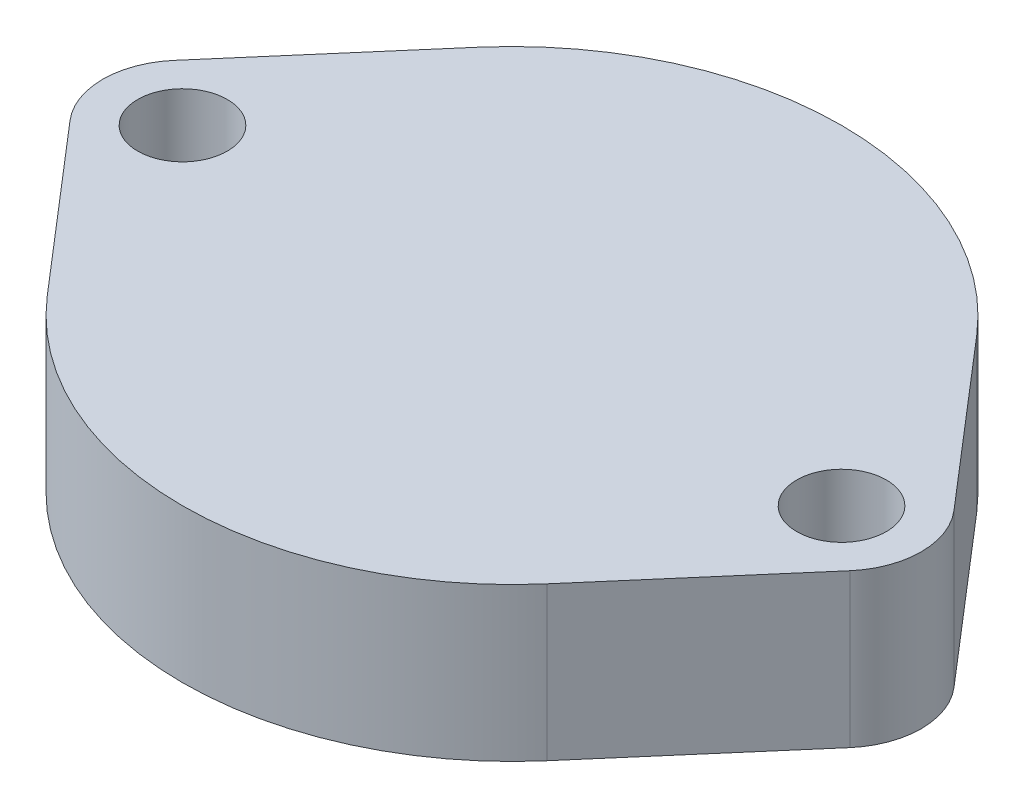
ISO-10303-21;
HEADER;
FILE_DESCRIPTION(('STEP AP214'),'2;1');
FILE_NAME('part.step','',(''),(''),'','','');
FILE_SCHEMA(('AUTOMOTIVE_DESIGN { 1 0 10303 214 1 1 1 1 }'));
ENDSEC;
DATA;
#1=APPLICATION_CONTEXT('core data for automotive mechanical design processes');
#2=APPLICATION_PROTOCOL_DEFINITION('international standard','automotive_design',2000,#1);
#3=PRODUCT_CONTEXT('',#1,'mechanical');
#4=PRODUCT('Part','Part','',(#3));
#5=PRODUCT_RELATED_PRODUCT_CATEGORY('part','',(#4));
#6=PRODUCT_DEFINITION_FORMATION('','',#4);
#7=PRODUCT_DEFINITION_CONTEXT('part definition',#1,'design');
#8=PRODUCT_DEFINITION('design','',#6,#7);
#9=PRODUCT_DEFINITION_SHAPE('','',#8);
#10=(LENGTH_UNIT() NAMED_UNIT(*) SI_UNIT(.MILLI.,.METRE.));
#11=(NAMED_UNIT(*) PLANE_ANGLE_UNIT() SI_UNIT($,.RADIAN.));
#12=(NAMED_UNIT(*) SI_UNIT($,.STERADIAN.) SOLID_ANGLE_UNIT());
#13=UNCERTAINTY_MEASURE_WITH_UNIT(LENGTH_MEASURE(1.E-05),#10,'distance_accuracy_value','');
#14=(GEOMETRIC_REPRESENTATION_CONTEXT(3) GLOBAL_UNCERTAINTY_ASSIGNED_CONTEXT((#13)) GLOBAL_UNIT_ASSIGNED_CONTEXT((#10,
#11,#12)) REPRESENTATION_CONTEXT('',''));
#15=CARTESIAN_POINT('',(0.,0.,0.));
#16=DIRECTION('',(0.,0.,1.));
#17=DIRECTION('',(1.,0.,0.));
#18=AXIS2_PLACEMENT_3D('',#15,#16,#17);
#19=CARTESIAN_POINT('',(-12.7,5.9055,0.));
#20=DIRECTION('',(0.,1.,0.));
#21=DIRECTION('',(0.,0.,1.));
#22=AXIS2_PLACEMENT_3D('',#19,#20,#21);
#23=PLANE('',#22);
#24=CARTESIAN_POINT('',(-12.7,5.9055,0.));
#25=DIRECTION('',(0.,1.,0.));
#26=DIRECTION('',(0.,0.,1.));
#27=AXIS2_PLACEMENT_3D('',#24,#25,#26);
#28=CIRCLE('',#27,1.7272);
#29=CARTESIAN_POINT('',(-12.7,5.9055,1.7272));
#30=VERTEX_POINT('',#29);
#31=EDGE_CURVE('E146',#30,#30,#28,.T.);
#32=ORIENTED_EDGE('',*,*,#31,.F.);
#33=EDGE_LOOP('',(#32));
#34=FACE_BOUND('',#33,.T.);
#35=CARTESIAN_POINT('',(-12.7,5.9055,0.));
#36=DIRECTION('',(0.,1.,0.));
#37=DIRECTION('',(0.,0.,1.));
#38=AXIS2_PLACEMENT_3D('',#35,#36,#37);
#39=CIRCLE('',#38,3.0734);
#40=CARTESIAN_POINT('',(-15.0296372,5.9055,-2.00463913869209));
#41=VERTEX_POINT('',#40);
#42=CARTESIAN_POINT('',(-15.0296372,5.9055,2.00463913869209));
#43=VERTEX_POINT('',#42);
#44=EDGE_CURVE('E164',#41,#43,#39,.T.);
#45=ORIENTED_EDGE('',*,*,#44,.T.);
#46=DIRECTION('',(0.652254551536438,0.,0.758));
#47=VECTOR('',#46,1.);
#48=CARTESIAN_POINT('',(-15.0296372,5.9055,2.00463913869209));
#49=LINE('',#48,#47);
#50=CARTESIAN_POINT('',(-9.62660000000001,5.9055,8.28363280451276));
#51=VERTEX_POINT('',#50);
#52=EDGE_CURVE('E100',#43,#51,#49,.T.);
#53=ORIENTED_EDGE('',*,*,#52,.T.);
#54=CARTESIAN_POINT('',(0.,5.9055,0.));
#55=DIRECTION('',(0.,1.,0.));
#56=DIRECTION('',(0.,0.,1.));
#57=AXIS2_PLACEMENT_3D('',#54,#55,#56);
#58=CIRCLE('',#57,12.7);
#59=CARTESIAN_POINT('',(9.6266,5.9055,8.28363280451276));
#60=VERTEX_POINT('',#59);
#61=EDGE_CURVE('E185',#51,#60,#58,.T.);
#62=ORIENTED_EDGE('',*,*,#61,.T.);
#63=DIRECTION('',(0.652254551536438,0.,-0.758));
#64=VECTOR('',#63,1.);
#65=CARTESIAN_POINT('',(15.0296372,5.9055,2.00463913869209));
#66=LINE('',#65,#64);
#67=CARTESIAN_POINT('',(15.0296372,5.9055,2.00463913869209));
#68=VERTEX_POINT('',#67);
#69=EDGE_CURVE('E199',#60,#68,#66,.T.);
#70=ORIENTED_EDGE('',*,*,#69,.T.);
#71=CARTESIAN_POINT('',(12.7,5.9055,0.));
#72=DIRECTION('',(0.,1.,0.));
#73=DIRECTION('',(0.,0.,1.));
#74=AXIS2_PLACEMENT_3D('',#71,#72,#73);
#75=CIRCLE('',#74,3.0734);
#76=CARTESIAN_POINT('',(15.0296372,5.9055,-2.00463913869209));
#77=VERTEX_POINT('',#76);
#78=EDGE_CURVE('E119',#68,#77,#75,.T.);
#79=ORIENTED_EDGE('',*,*,#78,.T.);
#80=DIRECTION('',(-0.652254551536438,0.,-0.758));
#81=VECTOR('',#80,1.);
#82=CARTESIAN_POINT('',(9.6266,5.9055,-8.28363280451276));
#83=LINE('',#82,#81);
#84=CARTESIAN_POINT('',(9.6266,5.9055,-8.28363280451276));
#85=VERTEX_POINT('',#84);
#86=EDGE_CURVE('E113',#77,#85,#83,.T.);
#87=ORIENTED_EDGE('',*,*,#86,.T.);
#88=CARTESIAN_POINT('',(0.,5.9055,0.));
#89=DIRECTION('',(0.,1.,0.));
#90=DIRECTION('',(0.,0.,1.));
#91=AXIS2_PLACEMENT_3D('',#88,#89,#90);
#92=CIRCLE('',#91,12.7);
#93=CARTESIAN_POINT('',(-9.6266,5.9055,-8.28363280451276));
#94=VERTEX_POINT('',#93);
#95=EDGE_CURVE('E117',#85,#94,#92,.T.);
#96=ORIENTED_EDGE('',*,*,#95,.T.);
#97=DIRECTION('',(-0.652254551536438,0.,0.758));
#98=VECTOR('',#97,1.);
#99=CARTESIAN_POINT('',(-15.0296372,5.9055,-2.00463913869209));
#100=LINE('',#99,#98);
#101=EDGE_CURVE('E57',#94,#41,#100,.T.);
#102=ORIENTED_EDGE('',*,*,#101,.T.);
#103=EDGE_LOOP('',(#45,#53,#62,#70,#79,#87,#96,#102));
#104=FACE_BOUND('',#103,.T.);
#105=CARTESIAN_POINT('',(12.7,5.9055,0.));
#106=DIRECTION('',(0.,1.,0.));
#107=DIRECTION('',(0.,0.,1.));
#108=AXIS2_PLACEMENT_3D('',#105,#106,#107);
#109=CIRCLE('',#108,1.7272);
#110=CARTESIAN_POINT('',(12.7,5.9055,1.7272));
#111=VERTEX_POINT('',#110);
#112=EDGE_CURVE('E213',#111,#111,#109,.T.);
#113=ORIENTED_EDGE('',*,*,#112,.F.);
#114=EDGE_LOOP('',(#113));
#115=FACE_BOUND('',#114,.T.);
#116=ADVANCED_FACE('F39',(#34,#104,#115),#23,.T.);
#117=CARTESIAN_POINT('',(-12.7,0.,0.));
#118=DIRECTION('',(0.,1.,0.));
#119=DIRECTION('',(0.,0.,1.));
#120=AXIS2_PLACEMENT_3D('',#117,#118,#119);
#121=PLANE('',#120);
#122=CARTESIAN_POINT('',(-12.7,0.,0.));
#123=DIRECTION('',(0.,1.,0.));
#124=DIRECTION('',(0.,0.,1.));
#125=AXIS2_PLACEMENT_3D('',#122,#123,#124);
#126=CIRCLE('',#125,3.0734);
#127=CARTESIAN_POINT('',(-15.0296372,0.,-2.00463913869209));
#128=VERTEX_POINT('',#127);
#129=CARTESIAN_POINT('',(-15.0296372,0.,2.00463913869209));
#130=VERTEX_POINT('',#129);
#131=EDGE_CURVE('E141',#128,#130,#126,.T.);
#132=ORIENTED_EDGE('',*,*,#131,.F.);
#133=DIRECTION('',(-0.652254551536438,0.,0.758));
#134=VECTOR('',#133,1.);
#135=CARTESIAN_POINT('',(-15.0296372,0.,-2.00463913869209));
#136=LINE('',#135,#134);
#137=CARTESIAN_POINT('',(-9.6266,0.,-8.28363280451276));
#138=VERTEX_POINT('',#137);
#139=EDGE_CURVE('E92',#138,#128,#136,.T.);
#140=ORIENTED_EDGE('',*,*,#139,.F.);
#141=CARTESIAN_POINT('',(0.,0.,0.));
#142=DIRECTION('',(0.,1.,0.));
#143=DIRECTION('',(0.,0.,1.));
#144=AXIS2_PLACEMENT_3D('',#141,#142,#143);
#145=CIRCLE('',#144,12.7);
#146=CARTESIAN_POINT('',(9.6266,0.,-8.28363280451276));
#147=VERTEX_POINT('',#146);
#148=EDGE_CURVE('E86',#147,#138,#145,.T.);
#149=ORIENTED_EDGE('',*,*,#148,.F.);
#150=DIRECTION('',(-0.652254551536438,0.,-0.758));
#151=VECTOR('',#150,1.);
#152=CARTESIAN_POINT('',(9.6266,0.,-8.28363280451276));
#153=LINE('',#152,#151);
#154=CARTESIAN_POINT('',(15.0296372,0.,-2.00463913869209));
#155=VERTEX_POINT('',#154);
#156=EDGE_CURVE('E128',#155,#147,#153,.T.);
#157=ORIENTED_EDGE('',*,*,#156,.F.);
#158=CARTESIAN_POINT('',(12.7,0.,0.));
#159=DIRECTION('',(0.,1.,0.));
#160=DIRECTION('',(0.,0.,1.));
#161=AXIS2_PLACEMENT_3D('',#158,#159,#160);
#162=CIRCLE('',#161,3.0734);
#163=CARTESIAN_POINT('',(15.0296372,0.,2.00463913869209));
#164=VERTEX_POINT('',#163);
#165=EDGE_CURVE('E155',#164,#155,#162,.T.);
#166=ORIENTED_EDGE('',*,*,#165,.F.);
#167=DIRECTION('',(0.652254551536438,0.,-0.758));
#168=VECTOR('',#167,1.);
#169=CARTESIAN_POINT('',(15.0296372,0.,2.00463913869209));
#170=LINE('',#169,#168);
#171=CARTESIAN_POINT('',(9.6266,0.,8.28363280451276));
#172=VERTEX_POINT('',#171);
#173=EDGE_CURVE('E152',#172,#164,#170,.T.);
#174=ORIENTED_EDGE('',*,*,#173,.F.);
#175=CARTESIAN_POINT('',(0.,0.,0.));
#176=DIRECTION('',(0.,1.,0.));
#177=DIRECTION('',(0.,0.,1.));
#178=AXIS2_PLACEMENT_3D('',#175,#176,#177);
#179=CIRCLE('',#178,12.7);
#180=CARTESIAN_POINT('',(-9.62660000000001,0.,8.28363280451276));
#181=VERTEX_POINT('',#180);
#182=EDGE_CURVE('E149',#181,#172,#179,.T.);
#183=ORIENTED_EDGE('',*,*,#182,.F.);
#184=DIRECTION('',(0.652254551536438,0.,0.758));
#185=VECTOR('',#184,1.);
#186=CARTESIAN_POINT('',(-15.0296372,0.,2.00463913869209));
#187=LINE('',#186,#185);
#188=EDGE_CURVE('E145',#130,#181,#187,.T.);
#189=ORIENTED_EDGE('',*,*,#188,.F.);
#190=EDGE_LOOP('',(#132,#140,#149,#157,#166,#174,#183,#189));
#191=FACE_BOUND('',#190,.T.);
#192=CARTESIAN_POINT('',(-12.7,0.,0.));
#193=DIRECTION('',(0.,1.,0.));
#194=DIRECTION('',(0.,0.,1.));
#195=AXIS2_PLACEMENT_3D('',#192,#193,#194);
#196=CIRCLE('',#195,1.7272);
#197=CARTESIAN_POINT('',(-12.7,0.,1.7272));
#198=VERTEX_POINT('',#197);
#199=EDGE_CURVE('E209',#198,#198,#196,.T.);
#200=ORIENTED_EDGE('',*,*,#199,.T.);
#201=EDGE_LOOP('',(#200));
#202=FACE_BOUND('',#201,.T.);
#203=CARTESIAN_POINT('',(12.7,0.,0.));
#204=DIRECTION('',(0.,1.,0.));
#205=DIRECTION('',(0.,0.,1.));
#206=AXIS2_PLACEMENT_3D('',#203,#204,#205);
#207=CIRCLE('',#206,1.7272);
#208=CARTESIAN_POINT('',(12.7,0.,1.7272));
#209=VERTEX_POINT('',#208);
#210=EDGE_CURVE('E217',#209,#209,#207,.T.);
#211=ORIENTED_EDGE('',*,*,#210,.T.);
#212=EDGE_LOOP('',(#211));
#213=FACE_BOUND('',#212,.T.);
#214=ADVANCED_FACE('F189',(#191,#202,#213),#121,.F.);
#215=CARTESIAN_POINT('',(-12.7,5.9055,0.));
#216=DIRECTION('',(0.,-1.,0.));
#217=DIRECTION('',(0.,0.,-1.));
#218=AXIS2_PLACEMENT_3D('',#215,#216,#217);
#219=CYLINDRICAL_SURFACE('',#218,3.0734);
#220=ORIENTED_EDGE('',*,*,#131,.T.);
#221=DIRECTION('',(0.,-1.,0.));
#222=VECTOR('',#221,1.);
#223=CARTESIAN_POINT('',(-15.0296372,5.9055,2.00463913869209));
#224=LINE('',#223,#222);
#225=EDGE_CURVE('E11',#43,#130,#224,.T.);
#226=ORIENTED_EDGE('',*,*,#225,.F.);
#227=ORIENTED_EDGE('',*,*,#44,.F.);
#228=DIRECTION('',(0.,-1.,0.));
#229=VECTOR('',#228,1.);
#230=CARTESIAN_POINT('',(-15.0296372,5.9055,-2.00463913869209));
#231=LINE('',#230,#229);
#232=EDGE_CURVE('E137',#41,#128,#231,.T.);
#233=ORIENTED_EDGE('',*,*,#232,.T.);
#234=EDGE_LOOP('',(#220,#226,#227,#233));
#235=FACE_BOUND('',#234,.T.);
#236=ADVANCED_FACE('F41',(#235),#219,.T.);
#237=CARTESIAN_POINT('',(-15.0296372,5.9055,2.00463913869209));
#238=DIRECTION('',(0.758,0.,-0.652254551536438));
#239=DIRECTION('',(-0.652254551536438,0.,-0.758));
#240=AXIS2_PLACEMENT_3D('',#237,#238,#239);
#241=PLANE('',#240);
#242=ORIENTED_EDGE('',*,*,#188,.T.);
#243=DIRECTION('',(0.,-1.,0.));
#244=VECTOR('',#243,1.);
#245=CARTESIAN_POINT('',(-9.62660000000001,5.9055,8.28363280451276));
#246=LINE('',#245,#244);
#247=EDGE_CURVE('E49',#51,#181,#246,.T.);
#248=ORIENTED_EDGE('',*,*,#247,.F.);
#249=ORIENTED_EDGE('',*,*,#52,.F.);
#250=ORIENTED_EDGE('',*,*,#225,.T.);
#251=EDGE_LOOP('',(#242,#248,#249,#250));
#252=FACE_BOUND('',#251,.T.);
#253=ADVANCED_FACE('F251',(#252),#241,.F.);
#254=CARTESIAN_POINT('',(0.,5.9055,0.));
#255=DIRECTION('',(0.,-1.,0.));
#256=DIRECTION('',(0.,0.,-1.));
#257=AXIS2_PLACEMENT_3D('',#254,#255,#256);
#258=CYLINDRICAL_SURFACE('',#257,12.7);
#259=ORIENTED_EDGE('',*,*,#182,.T.);
#260=DIRECTION('',(0.,-1.,0.));
#261=VECTOR('',#260,1.);
#262=CARTESIAN_POINT('',(9.6266,5.9055,8.28363280451276));
#263=LINE('',#262,#261);
#264=EDGE_CURVE('E175',#60,#172,#263,.T.);
#265=ORIENTED_EDGE('',*,*,#264,.F.);
#266=ORIENTED_EDGE('',*,*,#61,.F.);
#267=ORIENTED_EDGE('',*,*,#247,.T.);
#268=EDGE_LOOP('',(#259,#265,#266,#267));
#269=FACE_BOUND('',#268,.T.);
#270=ADVANCED_FACE('F183',(#269),#258,.T.);
#271=CARTESIAN_POINT('',(15.0296372,5.9055,2.00463913869209));
#272=DIRECTION('',(-0.758,0.,-0.652254551536438));
#273=DIRECTION('',(-0.652254551536438,0.,0.758));
#274=AXIS2_PLACEMENT_3D('',#271,#272,#273);
#275=PLANE('',#274);
#276=ORIENTED_EDGE('',*,*,#173,.T.);
#277=DIRECTION('',(0.,-1.,0.));
#278=VECTOR('',#277,1.);
#279=CARTESIAN_POINT('',(15.0296372,5.9055,2.00463913869209));
#280=LINE('',#279,#278);
#281=EDGE_CURVE('E171',#68,#164,#280,.T.);
#282=ORIENTED_EDGE('',*,*,#281,.F.);
#283=ORIENTED_EDGE('',*,*,#69,.F.);
#284=ORIENTED_EDGE('',*,*,#264,.T.);
#285=EDGE_LOOP('',(#276,#282,#283,#284));
#286=FACE_BOUND('',#285,.T.);
#287=ADVANCED_FACE('F194',(#286),#275,.F.);
#288=CARTESIAN_POINT('',(12.7,5.9055,0.));
#289=DIRECTION('',(0.,-1.,0.));
#290=DIRECTION('',(0.,0.,-1.));
#291=AXIS2_PLACEMENT_3D('',#288,#289,#290);
#292=CYLINDRICAL_SURFACE('',#291,3.0734);
#293=ORIENTED_EDGE('',*,*,#165,.T.);
#294=DIRECTION('',(0.,-1.,0.));
#295=VECTOR('',#294,1.);
#296=CARTESIAN_POINT('',(15.0296372,5.9055,-2.00463913869209));
#297=LINE('',#296,#295);
#298=EDGE_CURVE('E130',#77,#155,#297,.T.);
#299=ORIENTED_EDGE('',*,*,#298,.F.);
#300=ORIENTED_EDGE('',*,*,#78,.F.);
#301=ORIENTED_EDGE('',*,*,#281,.T.);
#302=EDGE_LOOP('',(#293,#299,#300,#301));
#303=FACE_BOUND('',#302,.T.);
#304=ADVANCED_FACE('F197',(#303),#292,.T.);
#305=CARTESIAN_POINT('',(9.6266,5.9055,-8.28363280451276));
#306=DIRECTION('',(-0.758,0.,0.652254551536438));
#307=DIRECTION('',(0.652254551536438,0.,0.758));
#308=AXIS2_PLACEMENT_3D('',#305,#306,#307);
#309=PLANE('',#308);
#310=ORIENTED_EDGE('',*,*,#156,.T.);
#311=DIRECTION('',(0.,-1.,0.));
#312=VECTOR('',#311,1.);
#313=CARTESIAN_POINT('',(9.6266,5.9055,-8.28363280451276));
#314=LINE('',#313,#312);
#315=EDGE_CURVE('E125',#85,#147,#314,.T.);
#316=ORIENTED_EDGE('',*,*,#315,.F.);
#317=ORIENTED_EDGE('',*,*,#86,.F.);
#318=ORIENTED_EDGE('',*,*,#298,.T.);
#319=EDGE_LOOP('',(#310,#316,#317,#318));
#320=FACE_BOUND('',#319,.T.);
#321=ADVANCED_FACE('F126',(#320),#309,.F.);
#322=CARTESIAN_POINT('',(0.,5.9055,0.));
#323=DIRECTION('',(0.,-1.,0.));
#324=DIRECTION('',(0.,0.,-1.));
#325=AXIS2_PLACEMENT_3D('',#322,#323,#324);
#326=CYLINDRICAL_SURFACE('',#325,12.7);
#327=ORIENTED_EDGE('',*,*,#148,.T.);
#328=DIRECTION('',(0.,-1.,0.));
#329=VECTOR('',#328,1.);
#330=CARTESIAN_POINT('',(-9.6266,5.9055,-8.28363280451276));
#331=LINE('',#330,#329);
#332=EDGE_CURVE('E131',#94,#138,#331,.T.);
#333=ORIENTED_EDGE('',*,*,#332,.F.);
#334=ORIENTED_EDGE('',*,*,#95,.F.);
#335=ORIENTED_EDGE('',*,*,#315,.T.);
#336=EDGE_LOOP('',(#327,#333,#334,#335));
#337=FACE_BOUND('',#336,.T.);
#338=ADVANCED_FACE('F133',(#337),#326,.T.);
#339=CARTESIAN_POINT('',(-15.0296372,5.9055,-2.00463913869209));
#340=DIRECTION('',(0.758,0.,0.652254551536438));
#341=DIRECTION('',(0.652254551536438,0.,-0.758));
#342=AXIS2_PLACEMENT_3D('',#339,#340,#341);
#343=PLANE('',#342);
#344=ORIENTED_EDGE('',*,*,#139,.T.);
#345=ORIENTED_EDGE('',*,*,#232,.F.);
#346=ORIENTED_EDGE('',*,*,#101,.F.);
#347=ORIENTED_EDGE('',*,*,#332,.T.);
#348=EDGE_LOOP('',(#344,#345,#346,#347));
#349=FACE_BOUND('',#348,.T.);
#350=ADVANCED_FACE('F239',(#349),#343,.F.);
#351=CARTESIAN_POINT('',(-12.7,5.9055,0.));
#352=DIRECTION('',(0.,-1.,0.));
#353=DIRECTION('',(0.,0.,-1.));
#354=AXIS2_PLACEMENT_3D('',#351,#352,#353);
#355=CYLINDRICAL_SURFACE('',#354,1.7272);
#356=ORIENTED_EDGE('',*,*,#31,.T.);
#357=EDGE_LOOP('',(#356));
#358=FACE_BOUND('',#357,.T.);
#359=ORIENTED_EDGE('',*,*,#199,.F.);
#360=EDGE_LOOP('',(#359));
#361=FACE_BOUND('',#360,.T.);
#362=ADVANCED_FACE('F236',(#358,#361),#355,.F.);
#363=CARTESIAN_POINT('',(12.7,5.9055,0.));
#364=DIRECTION('',(0.,-1.,0.));
#365=DIRECTION('',(0.,0.,-1.));
#366=AXIS2_PLACEMENT_3D('',#363,#364,#365);
#367=CYLINDRICAL_SURFACE('',#366,1.7272);
#368=ORIENTED_EDGE('',*,*,#112,.T.);
#369=EDGE_LOOP('',(#368));
#370=FACE_BOUND('',#369,.T.);
#371=ORIENTED_EDGE('',*,*,#210,.F.);
#372=EDGE_LOOP('',(#371));
#373=FACE_BOUND('',#372,.T.);
#374=ADVANCED_FACE('F225',(#370,#373),#367,.F.);
#375=CLOSED_SHELL('',(#116,#214,#236,#253,#270,#287,#304,#321,#338,#350,#362,#374));
#376=MANIFOLD_SOLID_BREP('B2',#375);
#377=ADVANCED_BREP_SHAPE_REPRESENTATION('',(#18,#376),#14);
#378=SHAPE_DEFINITION_REPRESENTATION(#9,#377);
ENDSEC;
END-ISO-10303-21;
